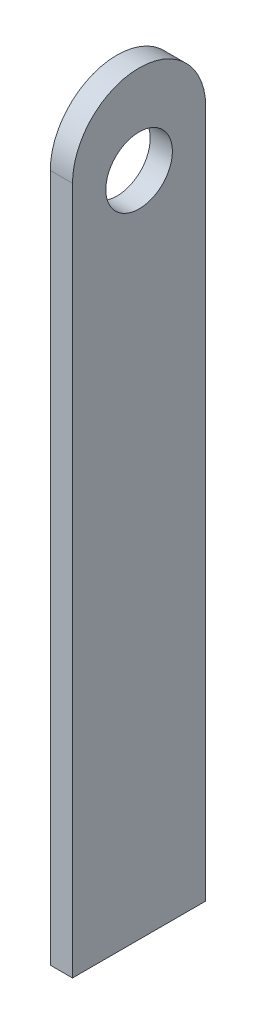
ISO-10303-21;
HEADER;
FILE_DESCRIPTION(('STEP AP214'),'2;1');
FILE_NAME('part.step','',(''),(''),'','','');
FILE_SCHEMA(('AUTOMOTIVE_DESIGN { 1 0 10303 214 1 1 1 1 }'));
ENDSEC;
DATA;
#1=APPLICATION_CONTEXT('core data for automotive mechanical design processes');
#2=APPLICATION_PROTOCOL_DEFINITION('international standard','automotive_design',2000,#1);
#3=PRODUCT_CONTEXT('',#1,'mechanical');
#4=PRODUCT('Part','Part','',(#3));
#5=PRODUCT_RELATED_PRODUCT_CATEGORY('part','',(#4));
#6=PRODUCT_DEFINITION_FORMATION('','',#4);
#7=PRODUCT_DEFINITION_CONTEXT('part definition',#1,'design');
#8=PRODUCT_DEFINITION('design','',#6,#7);
#9=PRODUCT_DEFINITION_SHAPE('','',#8);
#10=(LENGTH_UNIT() NAMED_UNIT(*) SI_UNIT(.MILLI.,.METRE.));
#11=(NAMED_UNIT(*) PLANE_ANGLE_UNIT() SI_UNIT($,.RADIAN.));
#12=(NAMED_UNIT(*) SI_UNIT($,.STERADIAN.) SOLID_ANGLE_UNIT());
#13=UNCERTAINTY_MEASURE_WITH_UNIT(LENGTH_MEASURE(1.E-05),#10,'distance_accuracy_value','');
#14=(GEOMETRIC_REPRESENTATION_CONTEXT(3) GLOBAL_UNCERTAINTY_ASSIGNED_CONTEXT((#13)) GLOBAL_UNIT_ASSIGNED_CONTEXT((#10,
#11,#12)) REPRESENTATION_CONTEXT('',''));
#15=CARTESIAN_POINT('',(0.,0.,0.));
#16=DIRECTION('',(0.,0.,1.));
#17=DIRECTION('',(1.,0.,0.));
#18=AXIS2_PLACEMENT_3D('',#15,#16,#17);
#19=CARTESIAN_POINT('',(3.175,0.,0.));
#20=DIRECTION('',(1.,0.,0.));
#21=DIRECTION('',(0.,0.,-1.));
#22=AXIS2_PLACEMENT_3D('',#19,#20,#21);
#23=PLANE('',#22);
#24=CARTESIAN_POINT('',(3.175,-12.7,-9.525));
#25=DIRECTION('',(1.,0.,0.));
#26=DIRECTION('',(0.,0.,-1.));
#27=AXIS2_PLACEMENT_3D('',#24,#25,#26);
#28=CIRCLE('',#27,4.7625);
#29=CARTESIAN_POINT('',(3.175,-12.7,-14.2875));
#30=VERTEX_POINT('',#29);
#31=EDGE_CURVE('E81',#30,#30,#28,.F.);
#32=ORIENTED_EDGE('',*,*,#31,.T.);
#33=EDGE_LOOP('',(#32));
#34=FACE_BOUND('',#33,.T.);
#35=DIRECTION('',(0.,0.,-1.));
#36=VECTOR('',#35,1.);
#37=CARTESIAN_POINT('',(3.175,-107.95,0.));
#38=LINE('',#37,#36);
#39=CARTESIAN_POINT('',(3.175,-107.95,-19.05));
#40=VERTEX_POINT('',#39);
#41=CARTESIAN_POINT('',(3.175,-107.95,0.));
#42=VERTEX_POINT('',#41);
#43=EDGE_CURVE('E69',#40,#42,#38,.F.);
#44=ORIENTED_EDGE('',*,*,#43,.F.);
#45=DIRECTION('',(0.,1.,0.));
#46=VECTOR('',#45,1.);
#47=CARTESIAN_POINT('',(3.175,-107.95,-19.05));
#48=LINE('',#47,#46);
#49=CARTESIAN_POINT('',(3.175,-9.525,-19.05));
#50=VERTEX_POINT('',#49);
#51=EDGE_CURVE('E57',#50,#40,#48,.F.);
#52=ORIENTED_EDGE('',*,*,#51,.F.);
#53=CARTESIAN_POINT('',(3.175,-9.525,-9.525));
#54=DIRECTION('',(-1.,0.,0.));
#55=DIRECTION('',(0.,0.,1.));
#56=AXIS2_PLACEMENT_3D('',#53,#54,#55);
#57=CIRCLE('',#56,9.525);
#58=CARTESIAN_POINT('',(3.175,-9.525,0.));
#59=VERTEX_POINT('',#58);
#60=EDGE_CURVE('E19',#59,#50,#57,.T.);
#61=ORIENTED_EDGE('',*,*,#60,.F.);
#62=DIRECTION('',(0.,1.,0.));
#63=VECTOR('',#62,1.);
#64=CARTESIAN_POINT('',(3.175,0.,0.));
#65=LINE('',#64,#63);
#66=EDGE_CURVE('E52',#42,#59,#65,.T.);
#67=ORIENTED_EDGE('',*,*,#66,.F.);
#68=EDGE_LOOP('',(#44,#52,#61,#67));
#69=FACE_BOUND('',#68,.T.);
#70=ADVANCED_FACE('F16',(#34,#69),#23,.T.);
#71=CARTESIAN_POINT('',(0.,0.,0.));
#72=DIRECTION('',(0.,0.,1.));
#73=DIRECTION('',(1.,0.,0.));
#74=AXIS2_PLACEMENT_3D('',#71,#72,#73);
#75=PLANE('',#74);
#76=DIRECTION('',(1.,0.,0.));
#77=VECTOR('',#76,1.);
#78=CARTESIAN_POINT('',(0.,-107.95,0.));
#79=LINE('',#78,#77);
#80=CARTESIAN_POINT('',(0.,-107.95,0.));
#81=VERTEX_POINT('',#80);
#82=EDGE_CURVE('E64',#42,#81,#79,.F.);
#83=ORIENTED_EDGE('',*,*,#82,.F.);
#84=ORIENTED_EDGE('',*,*,#66,.T.);
#85=DIRECTION('',(-1.,0.,0.));
#86=VECTOR('',#85,1.);
#87=CARTESIAN_POINT('',(14.94917,-9.525,0.));
#88=LINE('',#87,#86);
#89=CARTESIAN_POINT('',(0.,-9.525,0.));
#90=VERTEX_POINT('',#89);
#91=EDGE_CURVE('E80',#90,#59,#88,.F.);
#92=ORIENTED_EDGE('',*,*,#91,.F.);
#93=DIRECTION('',(0.,1.,0.));
#94=VECTOR('',#93,1.);
#95=CARTESIAN_POINT('',(0.,0.,0.));
#96=LINE('',#95,#94);
#97=EDGE_CURVE('E75',#90,#81,#96,.F.);
#98=ORIENTED_EDGE('',*,*,#97,.T.);
#99=EDGE_LOOP('',(#83,#84,#92,#98));
#100=FACE_BOUND('',#99,.T.);
#101=ADVANCED_FACE('F79',(#100),#75,.T.);
#102=CARTESIAN_POINT('',(0.,-107.95,0.));
#103=DIRECTION('',(0.,-1.,0.));
#104=DIRECTION('',(0.,0.,-1.));
#105=AXIS2_PLACEMENT_3D('',#102,#103,#104);
#106=PLANE('',#105);
#107=ORIENTED_EDGE('',*,*,#43,.T.);
#108=ORIENTED_EDGE('',*,*,#82,.T.);
#109=DIRECTION('',(0.,0.,-1.));
#110=VECTOR('',#109,1.);
#111=CARTESIAN_POINT('',(0.,-107.95,0.));
#112=LINE('',#111,#110);
#113=CARTESIAN_POINT('',(0.,-107.95,-19.05));
#114=VERTEX_POINT('',#113);
#115=EDGE_CURVE('E68',#81,#114,#112,.T.);
#116=ORIENTED_EDGE('',*,*,#115,.T.);
#117=DIRECTION('',(-1.,0.,0.));
#118=VECTOR('',#117,1.);
#119=CARTESIAN_POINT('',(0.,-107.95,-19.05));
#120=LINE('',#119,#118);
#121=EDGE_CURVE('E92',#40,#114,#120,.T.);
#122=ORIENTED_EDGE('',*,*,#121,.F.);
#123=EDGE_LOOP('',(#107,#108,#116,#122));
#124=FACE_BOUND('',#123,.T.);
#125=ADVANCED_FACE('F66',(#124),#106,.T.);
#126=CARTESIAN_POINT('',(0.,-107.95,-19.05));
#127=DIRECTION('',(0.,0.,-1.));
#128=DIRECTION('',(-1.,0.,0.));
#129=AXIS2_PLACEMENT_3D('',#126,#127,#128);
#130=PLANE('',#129);
#131=ORIENTED_EDGE('',*,*,#121,.T.);
#132=DIRECTION('',(0.,1.,0.));
#133=VECTOR('',#132,1.);
#134=CARTESIAN_POINT('',(0.,0.,-19.05));
#135=LINE('',#134,#133);
#136=CARTESIAN_POINT('',(0.,-9.525,-19.05));
#137=VERTEX_POINT('',#136);
#138=EDGE_CURVE('E77',#114,#137,#135,.T.);
#139=ORIENTED_EDGE('',*,*,#138,.T.);
#140=DIRECTION('',(-1.,0.,0.));
#141=VECTOR('',#140,1.);
#142=CARTESIAN_POINT('',(14.94917,-9.525,-19.05));
#143=LINE('',#142,#141);
#144=EDGE_CURVE('E34',#50,#137,#143,.T.);
#145=ORIENTED_EDGE('',*,*,#144,.F.);
#146=ORIENTED_EDGE('',*,*,#51,.T.);
#147=EDGE_LOOP('',(#131,#139,#145,#146));
#148=FACE_BOUND('',#147,.T.);
#149=ADVANCED_FACE('F109',(#148),#130,.T.);
#150=CARTESIAN_POINT('',(14.94917,-9.525,-9.525));
#151=DIRECTION('',(-1.,0.,0.));
#152=DIRECTION('',(0.,0.,1.));
#153=AXIS2_PLACEMENT_3D('',#150,#151,#152);
#154=CYLINDRICAL_SURFACE('',#153,9.525);
#155=CARTESIAN_POINT('',(0.,-9.525,-9.525));
#156=DIRECTION('',(-1.,0.,0.));
#157=DIRECTION('',(0.,0.,1.));
#158=AXIS2_PLACEMENT_3D('',#155,#156,#157);
#159=CIRCLE('',#158,9.525);
#160=EDGE_CURVE('E25',#137,#90,#159,.F.);
#161=ORIENTED_EDGE('',*,*,#160,.T.);
#162=ORIENTED_EDGE('',*,*,#91,.T.);
#163=ORIENTED_EDGE('',*,*,#60,.T.);
#164=ORIENTED_EDGE('',*,*,#144,.T.);
#165=EDGE_LOOP('',(#161,#162,#163,#164));
#166=FACE_BOUND('',#165,.T.);
#167=ADVANCED_FACE('F111',(#166),#154,.T.);
#168=CARTESIAN_POINT('',(0.,-12.7,-9.525));
#169=DIRECTION('',(1.,0.,0.));
#170=DIRECTION('',(0.,0.,-1.));
#171=AXIS2_PLACEMENT_3D('',#168,#169,#170);
#172=CYLINDRICAL_SURFACE('',#171,4.7625);
#173=ORIENTED_EDGE('',*,*,#31,.F.);
#174=EDGE_LOOP('',(#173));
#175=FACE_BOUND('',#174,.T.);
#176=CARTESIAN_POINT('',(0.,-12.7,-9.525));
#177=DIRECTION('',(1.,0.,0.));
#178=DIRECTION('',(0.,0.,-1.));
#179=AXIS2_PLACEMENT_3D('',#176,#177,#178);
#180=CIRCLE('',#179,4.7625);
#181=CARTESIAN_POINT('',(0.,-12.7,-14.2875));
#182=VERTEX_POINT('',#181);
#183=EDGE_CURVE('E11',#182,#182,#180,.F.);
#184=ORIENTED_EDGE('',*,*,#183,.T.);
#185=EDGE_LOOP('',(#184));
#186=FACE_BOUND('',#185,.T.);
#187=ADVANCED_FACE('F118',(#175,#186),#172,.F.);
#188=CARTESIAN_POINT('',(0.,0.,0.));
#189=DIRECTION('',(1.,0.,0.));
#190=DIRECTION('',(0.,0.,-1.));
#191=AXIS2_PLACEMENT_3D('',#188,#189,#190);
#192=PLANE('',#191);
#193=ORIENTED_EDGE('',*,*,#183,.F.);
#194=EDGE_LOOP('',(#193));
#195=FACE_BOUND('',#194,.T.);
#196=ORIENTED_EDGE('',*,*,#138,.F.);
#197=ORIENTED_EDGE('',*,*,#115,.F.);
#198=ORIENTED_EDGE('',*,*,#97,.F.);
#199=ORIENTED_EDGE('',*,*,#160,.F.);
#200=EDGE_LOOP('',(#196,#197,#198,#199));
#201=FACE_BOUND('',#200,.T.);
#202=ADVANCED_FACE('F74',(#195,#201),#192,.F.);
#203=CLOSED_SHELL('',(#70,#101,#125,#149,#167,#187,#202));
#204=MANIFOLD_SOLID_BREP('B1',#203);
#205=ADVANCED_BREP_SHAPE_REPRESENTATION('',(#18,#204),#14);
#206=SHAPE_DEFINITION_REPRESENTATION(#9,#205);
ENDSEC;
END-ISO-10303-21;
